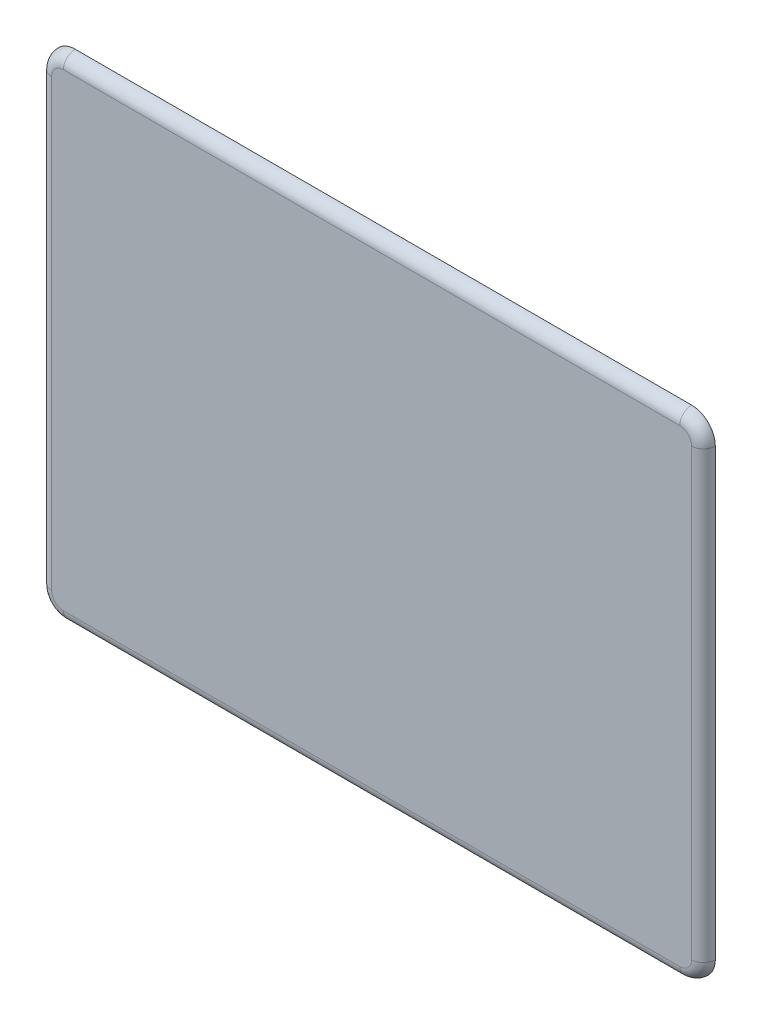
ISO-10303-21;
HEADER;
FILE_DESCRIPTION(('STEP AP214'),'2;1');
FILE_NAME('part.step','',(''),(''),'','','');
FILE_SCHEMA(('AUTOMOTIVE_DESIGN { 1 0 10303 214 1 1 1 1 }'));
ENDSEC;
DATA;
#1=APPLICATION_CONTEXT('core data for automotive mechanical design processes');
#2=APPLICATION_PROTOCOL_DEFINITION('international standard','automotive_design',2000,#1);
#3=PRODUCT_CONTEXT('',#1,'mechanical');
#4=PRODUCT('Part','Part','',(#3));
#5=PRODUCT_RELATED_PRODUCT_CATEGORY('part','',(#4));
#6=PRODUCT_DEFINITION_FORMATION('','',#4);
#7=PRODUCT_DEFINITION_CONTEXT('part definition',#1,'design');
#8=PRODUCT_DEFINITION('design','',#6,#7);
#9=PRODUCT_DEFINITION_SHAPE('','',#8);
#10=(LENGTH_UNIT() NAMED_UNIT(*) SI_UNIT(.MILLI.,.METRE.));
#11=(NAMED_UNIT(*) PLANE_ANGLE_UNIT() SI_UNIT($,.RADIAN.));
#12=(NAMED_UNIT(*) SI_UNIT($,.STERADIAN.) SOLID_ANGLE_UNIT());
#13=UNCERTAINTY_MEASURE_WITH_UNIT(LENGTH_MEASURE(1.E-05),#10,'distance_accuracy_value','');
#14=(GEOMETRIC_REPRESENTATION_CONTEXT(3) GLOBAL_UNCERTAINTY_ASSIGNED_CONTEXT((#13)) GLOBAL_UNIT_ASSIGNED_CONTEXT((#10,
#11,#12)) REPRESENTATION_CONTEXT('',''));
#15=CARTESIAN_POINT('',(0.,0.,0.));
#16=DIRECTION('',(0.,0.,1.));
#17=DIRECTION('',(1.,0.,0.));
#18=AXIS2_PLACEMENT_3D('',#15,#16,#17);
#19=CARTESIAN_POINT('',(0.,0.,0.7));
#20=DIRECTION('',(0.,0.,1.));
#21=DIRECTION('',(1.,0.,0.));
#22=AXIS2_PLACEMENT_3D('',#19,#20,#21);
#23=PLANE('',#22);
#24=CARTESIAN_POINT('',(-1.3,0.938189666446,0.7));
#25=DIRECTION('',(0.,0.,-1.));
#26=DIRECTION('',(-0.707106781186548,0.707106781186548,0.));
#27=AXIS2_PLACEMENT_3D('',#24,#25,#26);
#28=CIRCLE('',#27,0.05);
#29=CARTESIAN_POINT('',(-1.35,0.938189666446,0.7));
#30=VERTEX_POINT('',#29);
#31=CARTESIAN_POINT('',(-1.3,0.988189666446,0.7));
#32=VERTEX_POINT('',#31);
#33=EDGE_CURVE('E120',#30,#32,#28,.T.);
#34=ORIENTED_EDGE('',*,*,#33,.F.);
#35=DIRECTION('',(0.,1.,0.));
#36=VECTOR('',#35,1.);
#37=CARTESIAN_POINT('',(-1.35,-0.519094833223,0.7));
#38=LINE('',#37,#36);
#39=CARTESIAN_POINT('',(-1.35,-0.938189666446,0.7));
#40=VERTEX_POINT('',#39);
#41=EDGE_CURVE('E11',#40,#30,#38,.T.);
#42=ORIENTED_EDGE('',*,*,#41,.F.);
#43=CARTESIAN_POINT('',(-1.3,-0.938189666446,0.7));
#44=DIRECTION('',(0.,0.,-1.));
#45=DIRECTION('',(-0.707106781186548,-0.707106781186548,0.));
#46=AXIS2_PLACEMENT_3D('',#43,#44,#45);
#47=CIRCLE('',#46,0.05);
#48=CARTESIAN_POINT('',(-1.3,-0.988189666446,0.7));
#49=VERTEX_POINT('',#48);
#50=EDGE_CURVE('E29',#49,#40,#47,.T.);
#51=ORIENTED_EDGE('',*,*,#50,.F.);
#52=DIRECTION('',(-1.,0.,0.));
#53=VECTOR('',#52,1.);
#54=CARTESIAN_POINT('',(0.7,-0.988189666446,0.7));
#55=LINE('',#54,#53);
#56=CARTESIAN_POINT('',(1.3,-0.988189666446,0.7));
#57=VERTEX_POINT('',#56);
#58=EDGE_CURVE('E180',#57,#49,#55,.T.);
#59=ORIENTED_EDGE('',*,*,#58,.F.);
#60=CARTESIAN_POINT('',(1.3,-0.938189666446,0.7));
#61=DIRECTION('',(0.,0.,-1.));
#62=DIRECTION('',(0.707106781186548,-0.707106781186548,0.));
#63=AXIS2_PLACEMENT_3D('',#60,#61,#62);
#64=CIRCLE('',#63,0.05);
#65=CARTESIAN_POINT('',(1.35,-0.938189666446,0.7));
#66=VERTEX_POINT('',#65);
#67=EDGE_CURVE('E173',#66,#57,#64,.T.);
#68=ORIENTED_EDGE('',*,*,#67,.F.);
#69=DIRECTION('',(0.,-1.,0.));
#70=VECTOR('',#69,1.);
#71=CARTESIAN_POINT('',(1.35,0.519094833223,0.7));
#72=LINE('',#71,#70);
#73=CARTESIAN_POINT('',(1.35,0.938189666446,0.7));
#74=VERTEX_POINT('',#73);
#75=EDGE_CURVE('E166',#74,#66,#72,.T.);
#76=ORIENTED_EDGE('',*,*,#75,.F.);
#77=CARTESIAN_POINT('',(1.3,0.938189666446,0.7));
#78=DIRECTION('',(0.,0.,-1.));
#79=DIRECTION('',(0.707106781186548,0.707106781186548,0.));
#80=AXIS2_PLACEMENT_3D('',#77,#78,#79);
#81=CIRCLE('',#80,0.05);
#82=CARTESIAN_POINT('',(1.3,0.988189666446,0.7));
#83=VERTEX_POINT('',#82);
#84=EDGE_CURVE('E80',#83,#74,#81,.T.);
#85=ORIENTED_EDGE('',*,*,#84,.F.);
#86=DIRECTION('',(1.,0.,0.));
#87=VECTOR('',#86,1.);
#88=CARTESIAN_POINT('',(-0.7,0.988189666446,0.7));
#89=LINE('',#88,#87);
#90=EDGE_CURVE('E72',#32,#83,#89,.T.);
#91=ORIENTED_EDGE('',*,*,#90,.F.);
#92=EDGE_LOOP('',(#34,#42,#51,#59,#68,#76,#85,#91));
#93=FACE_BOUND('',#92,.T.);
#94=ADVANCED_FACE('F17',(#93),#23,.T.);
#95=CARTESIAN_POINT('',(-1.35,-0.519094833223,0.65));
#96=DIRECTION('',(0.,-1.,0.));
#97=DIRECTION('',(-0.707106781186548,0.,0.707106781186548));
#98=AXIS2_PLACEMENT_3D('',#95,#96,#97);
#99=CYLINDRICAL_SURFACE('',#98,0.05);
#100=CARTESIAN_POINT('',(-1.35,-0.938189666446,0.65));
#101=DIRECTION('',(0.,-1.,0.));
#102=DIRECTION('',(0.,0.,1.));
#103=AXIS2_PLACEMENT_3D('',#100,#101,#102);
#104=CIRCLE('',#103,0.05);
#105=CARTESIAN_POINT('',(-1.4,-0.938189666446,0.65));
#106=VERTEX_POINT('',#105);
#107=EDGE_CURVE('E107',#40,#106,#104,.T.);
#108=ORIENTED_EDGE('',*,*,#107,.F.);
#109=ORIENTED_EDGE('',*,*,#41,.T.);
#110=CARTESIAN_POINT('',(-1.35,0.938189666446,0.65));
#111=DIRECTION('',(0.,1.,0.));
#112=DIRECTION('',(-1.,0.,0.));
#113=AXIS2_PLACEMENT_3D('',#110,#111,#112);
#114=CIRCLE('',#113,0.05);
#115=CARTESIAN_POINT('',(-1.4,0.938189666446,0.65));
#116=VERTEX_POINT('',#115);
#117=EDGE_CURVE('E111',#116,#30,#114,.T.);
#118=ORIENTED_EDGE('',*,*,#117,.F.);
#119=DIRECTION('',(0.,-1.,0.));
#120=VECTOR('',#119,1.);
#121=CARTESIAN_POINT('',(-1.4,-0.519094833223,0.65));
#122=LINE('',#121,#120);
#123=EDGE_CURVE('E115',#116,#106,#122,.T.);
#124=ORIENTED_EDGE('',*,*,#123,.T.);
#125=EDGE_LOOP('',(#108,#109,#118,#124));
#126=FACE_BOUND('',#125,.T.);
#127=ADVANCED_FACE('F113',(#126),#99,.T.);
#128=CARTESIAN_POINT('',(-1.3,-0.988189666446,0.7));
#129=CARTESIAN_POINT('',(-1.35,-0.988189666445999,0.7));
#130=CARTESIAN_POINT('',(-1.35,-0.938189666446,0.7));
#131=CARTESIAN_POINT('',(-1.3,-1.038189666446,0.7));
#132=CARTESIAN_POINT('',(-1.4,-1.038189666446,0.7));
#133=CARTESIAN_POINT('',(-1.4,-0.938189666446,0.7));
#134=CARTESIAN_POINT('',(-1.3,-1.038189666446,0.65));
#135=CARTESIAN_POINT('',(-1.4,-1.038189666446,0.65));
#136=CARTESIAN_POINT('',(-1.4,-0.938189666446,0.65));
#137=(BOUNDED_SURFACE() B_SPLINE_SURFACE(2,2,((#128,#129,#130),(#131,#132,#133),(#134,#135,
#136)),.UNSPECIFIED.,.F.,.F.,.F.) B_SPLINE_SURFACE_WITH_KNOTS((3,3),(3,3),(-1.570796326795,0.),
(-1.570796326795,0.),
.UNSPECIFIED.) GEOMETRIC_REPRESENTATION_ITEM() RATIONAL_B_SPLINE_SURFACE(((1.,0.707106781187,
1.),(0.707106781187,0.5,0.707106781187),(1.,0.707106781187,1.))) REPRESENTATION_ITEM('') SURFACE());
#138=CARTESIAN_POINT('',(-1.3,-0.938189666446,0.65));
#139=DIRECTION('',(0.,0.,1.));
#140=DIRECTION('',(-0.707106781186548,-0.707106781186548,0.));
#141=AXIS2_PLACEMENT_3D('',#138,#139,#140);
#142=CIRCLE('',#141,0.1);
#143=CARTESIAN_POINT('',(-1.3,-1.038189666446,0.65));
#144=VERTEX_POINT('',#143);
#145=EDGE_CURVE('E136',#106,#144,#142,.T.);
#146=CARTESIAN_POINT('',(-1.3,-0.988189666446,0.65));
#147=DIRECTION('',(1.,0.,0.));
#148=DIRECTION('',(0.,0.,1.));
#149=AXIS2_PLACEMENT_3D('',#146,#147,#148);
#150=CIRCLE('',#149,0.05);
#151=EDGE_CURVE('E177',#49,#144,#150,.T.);
#152=ORIENTED_EDGE('',*,*,#107,.T.);
#153=ORIENTED_EDGE('',*,*,#145,.T.);
#154=ORIENTED_EDGE('',*,*,#151,.F.);
#155=ORIENTED_EDGE('',*,*,#50,.T.);
#156=EDGE_LOOP('',(#152,#153,#154,#155));
#157=FACE_BOUND('',#156,.T.);
#158=ADVANCED_FACE('F19',(#157),#137,.F.);
#159=CARTESIAN_POINT('',(0.7,-0.988189666446,0.65));
#160=DIRECTION('',(1.,0.,0.));
#161=DIRECTION('',(0.,-0.707106781186548,0.707106781186548));
#162=AXIS2_PLACEMENT_3D('',#159,#160,#161);
#163=CYLINDRICAL_SURFACE('',#162,0.05);
#164=ORIENTED_EDGE('',*,*,#151,.T.);
#165=DIRECTION('',(1.,0.,0.));
#166=VECTOR('',#165,1.);
#167=CARTESIAN_POINT('',(0.7,-1.038189666446,0.65));
#168=LINE('',#167,#166);
#169=CARTESIAN_POINT('',(1.3,-1.038189666446,0.65));
#170=VERTEX_POINT('',#169);
#171=EDGE_CURVE('E143',#144,#170,#168,.T.);
#172=ORIENTED_EDGE('',*,*,#171,.T.);
#173=CARTESIAN_POINT('',(1.3,-0.988189666446,0.65));
#174=DIRECTION('',(1.,0.,0.));
#175=DIRECTION('',(0.,0.,1.));
#176=AXIS2_PLACEMENT_3D('',#173,#174,#175);
#177=CIRCLE('',#176,0.05);
#178=EDGE_CURVE('E170',#57,#170,#177,.T.);
#179=ORIENTED_EDGE('',*,*,#178,.F.);
#180=ORIENTED_EDGE('',*,*,#58,.T.);
#181=EDGE_LOOP('',(#164,#172,#179,#180));
#182=FACE_BOUND('',#181,.T.);
#183=ADVANCED_FACE('F191',(#182),#163,.T.);
#184=CARTESIAN_POINT('',(1.35,-0.938189666446,0.7));
#185=CARTESIAN_POINT('',(1.35,-0.988189666445999,0.7));
#186=CARTESIAN_POINT('',(1.3,-0.988189666446,0.7));
#187=CARTESIAN_POINT('',(1.4,-0.938189666446,0.7));
#188=CARTESIAN_POINT('',(1.4,-1.038189666446,0.7));
#189=CARTESIAN_POINT('',(1.3,-1.038189666446,0.7));
#190=CARTESIAN_POINT('',(1.4,-0.938189666446,0.65));
#191=CARTESIAN_POINT('',(1.4,-1.038189666446,0.65));
#192=CARTESIAN_POINT('',(1.3,-1.038189666446,0.65));
#193=(BOUNDED_SURFACE() B_SPLINE_SURFACE(2,2,((#184,#185,#186),(#187,#188,#189),(#190,#191,
#192)),.UNSPECIFIED.,.F.,.F.,.F.) B_SPLINE_SURFACE_WITH_KNOTS((3,3),(3,3),(-1.570796326795,0.),
(-3.14159265359,-1.570796326795),
.UNSPECIFIED.) GEOMETRIC_REPRESENTATION_ITEM() RATIONAL_B_SPLINE_SURFACE(((1.,0.707106781187,
1.),(0.707106781187,0.5,0.707106781187),(1.,0.707106781187,1.))) REPRESENTATION_ITEM('') SURFACE());
#194=CARTESIAN_POINT('',(1.3,-0.938189666446,0.65));
#195=DIRECTION('',(0.,0.,1.));
#196=DIRECTION('',(0.707106781186548,-0.707106781186548,0.));
#197=AXIS2_PLACEMENT_3D('',#194,#195,#196);
#198=CIRCLE('',#197,0.1);
#199=CARTESIAN_POINT('',(1.4,-0.938189666446,0.65));
#200=VERTEX_POINT('',#199);
#201=EDGE_CURVE('E198',#170,#200,#198,.T.);
#202=CARTESIAN_POINT('',(1.35,-0.938189666446,0.65));
#203=DIRECTION('',(0.,1.,0.));
#204=DIRECTION('',(0.,0.,1.));
#205=AXIS2_PLACEMENT_3D('',#202,#203,#204);
#206=CIRCLE('',#205,0.05);
#207=EDGE_CURVE('E149',#66,#200,#206,.T.);
#208=ORIENTED_EDGE('',*,*,#178,.T.);
#209=ORIENTED_EDGE('',*,*,#201,.T.);
#210=ORIENTED_EDGE('',*,*,#207,.F.);
#211=ORIENTED_EDGE('',*,*,#67,.T.);
#212=EDGE_LOOP('',(#208,#209,#210,#211));
#213=FACE_BOUND('',#212,.T.);
#214=ADVANCED_FACE('F196',(#213),#193,.F.);
#215=CARTESIAN_POINT('',(1.35,0.519094833223,0.65));
#216=DIRECTION('',(0.,1.,0.));
#217=DIRECTION('',(0.707106781186548,0.,0.707106781186548));
#218=AXIS2_PLACEMENT_3D('',#215,#216,#217);
#219=CYLINDRICAL_SURFACE('',#218,0.05);
#220=ORIENTED_EDGE('',*,*,#207,.T.);
#221=DIRECTION('',(0.,1.,0.));
#222=VECTOR('',#221,1.);
#223=CARTESIAN_POINT('',(1.4,0.519094833223,0.65));
#224=LINE('',#223,#222);
#225=CARTESIAN_POINT('',(1.4,0.938189666446,0.65));
#226=VERTEX_POINT('',#225);
#227=EDGE_CURVE('E203',#200,#226,#224,.T.);
#228=ORIENTED_EDGE('',*,*,#227,.T.);
#229=CARTESIAN_POINT('',(1.35,0.938189666446,0.65));
#230=DIRECTION('',(0.,1.,0.));
#231=DIRECTION('',(0.,0.,1.));
#232=AXIS2_PLACEMENT_3D('',#229,#230,#231);
#233=CIRCLE('',#232,0.05);
#234=EDGE_CURVE('E150',#74,#226,#233,.T.);
#235=ORIENTED_EDGE('',*,*,#234,.F.);
#236=ORIENTED_EDGE('',*,*,#75,.T.);
#237=EDGE_LOOP('',(#220,#228,#235,#236));
#238=FACE_BOUND('',#237,.T.);
#239=ADVANCED_FACE('F201',(#238),#219,.T.);
#240=CARTESIAN_POINT('',(1.3,0.988189666446,0.7));
#241=CARTESIAN_POINT('',(1.35,0.988189666445999,0.7));
#242=CARTESIAN_POINT('',(1.35,0.938189666446,0.7));
#243=CARTESIAN_POINT('',(1.3,1.038189666446,0.7));
#244=CARTESIAN_POINT('',(1.4,1.038189666446,0.7));
#245=CARTESIAN_POINT('',(1.4,0.938189666446,0.7));
#246=CARTESIAN_POINT('',(1.3,1.038189666446,0.65));
#247=CARTESIAN_POINT('',(1.4,1.038189666446,0.65));
#248=CARTESIAN_POINT('',(1.4,0.938189666446,0.65));
#249=(BOUNDED_SURFACE() B_SPLINE_SURFACE(2,2,((#240,#241,#242),(#243,#244,#245),(#246,#247,
#248)),.UNSPECIFIED.,.F.,.F.,.F.) B_SPLINE_SURFACE_WITH_KNOTS((3,3),(3,3),(-1.570796326795,0.),
(1.570796326795,3.14159265359),
.UNSPECIFIED.) GEOMETRIC_REPRESENTATION_ITEM() RATIONAL_B_SPLINE_SURFACE(((1.,0.707106781187,
1.),(0.707106781187,0.5,0.707106781187),(1.,0.707106781187,1.))) REPRESENTATION_ITEM('') SURFACE());
#250=CARTESIAN_POINT('',(1.3,0.938189666446,0.65));
#251=DIRECTION('',(0.,0.,1.));
#252=DIRECTION('',(0.707106781186548,0.707106781186548,0.));
#253=AXIS2_PLACEMENT_3D('',#250,#251,#252);
#254=CIRCLE('',#253,0.1);
#255=CARTESIAN_POINT('',(1.3,1.038189666446,0.65));
#256=VERTEX_POINT('',#255);
#257=EDGE_CURVE('E121',#226,#256,#254,.T.);
#258=CARTESIAN_POINT('',(1.3,0.988189666446,0.65));
#259=DIRECTION('',(-1.,0.,0.));
#260=DIRECTION('',(0.,0.,1.));
#261=AXIS2_PLACEMENT_3D('',#258,#259,#260);
#262=CIRCLE('',#261,0.05);
#263=EDGE_CURVE('E156',#83,#256,#262,.T.);
#264=ORIENTED_EDGE('',*,*,#234,.T.);
#265=ORIENTED_EDGE('',*,*,#257,.T.);
#266=ORIENTED_EDGE('',*,*,#263,.F.);
#267=ORIENTED_EDGE('',*,*,#84,.T.);
#268=EDGE_LOOP('',(#264,#265,#266,#267));
#269=FACE_BOUND('',#268,.T.);
#270=ADVANCED_FACE('F206',(#269),#249,.F.);
#271=CARTESIAN_POINT('',(-0.7,0.988189666446,0.65));
#272=DIRECTION('',(-1.,0.,0.));
#273=DIRECTION('',(0.,0.707106781186548,0.707106781186548));
#274=AXIS2_PLACEMENT_3D('',#271,#272,#273);
#275=CYLINDRICAL_SURFACE('',#274,0.05);
#276=ORIENTED_EDGE('',*,*,#263,.T.);
#277=DIRECTION('',(-1.,0.,0.));
#278=VECTOR('',#277,1.);
#279=CARTESIAN_POINT('',(-0.7,1.038189666446,0.65));
#280=LINE('',#279,#278);
#281=CARTESIAN_POINT('',(-1.3,1.038189666446,0.65));
#282=VERTEX_POINT('',#281);
#283=EDGE_CURVE('E131',#256,#282,#280,.T.);
#284=ORIENTED_EDGE('',*,*,#283,.T.);
#285=CARTESIAN_POINT('',(-1.3,0.988189666446,0.65));
#286=DIRECTION('',(-1.,0.,0.));
#287=DIRECTION('',(0.,0.,1.));
#288=AXIS2_PLACEMENT_3D('',#285,#286,#287);
#289=CIRCLE('',#288,0.05);
#290=EDGE_CURVE('E126',#32,#282,#289,.T.);
#291=ORIENTED_EDGE('',*,*,#290,.F.);
#292=ORIENTED_EDGE('',*,*,#90,.T.);
#293=EDGE_LOOP('',(#276,#284,#291,#292));
#294=FACE_BOUND('',#293,.T.);
#295=ADVANCED_FACE('F299',(#294),#275,.T.);
#296=CARTESIAN_POINT('',(-1.35,0.938189666446,0.7));
#297=CARTESIAN_POINT('',(-1.35,0.988189666445999,0.7));
#298=CARTESIAN_POINT('',(-1.3,0.988189666446,0.7));
#299=CARTESIAN_POINT('',(-1.4,0.938189666446,0.7));
#300=CARTESIAN_POINT('',(-1.4,1.038189666446,0.7));
#301=CARTESIAN_POINT('',(-1.3,1.038189666446,0.7));
#302=CARTESIAN_POINT('',(-1.4,0.938189666446,0.65));
#303=CARTESIAN_POINT('',(-1.4,1.038189666446,0.65));
#304=CARTESIAN_POINT('',(-1.3,1.038189666446,0.65));
#305=(BOUNDED_SURFACE() B_SPLINE_SURFACE(2,2,((#296,#297,#298),(#299,#300,#301),(#302,#303,
#304)),.UNSPECIFIED.,.F.,.F.,.F.) B_SPLINE_SURFACE_WITH_KNOTS((3,3),(3,3),(-1.570796326795,0.),
(0.,1.570796326795),
.UNSPECIFIED.) GEOMETRIC_REPRESENTATION_ITEM() RATIONAL_B_SPLINE_SURFACE(((1.,0.707106781187,
1.),(0.707106781187,0.5,0.707106781187),(1.,0.707106781187,1.))) REPRESENTATION_ITEM('') SURFACE());
#306=CARTESIAN_POINT('',(-1.3,0.938189666446,0.65));
#307=DIRECTION('',(0.,0.,1.));
#308=DIRECTION('',(-0.707106781186548,0.707106781186548,0.));
#309=AXIS2_PLACEMENT_3D('',#306,#307,#308);
#310=CIRCLE('',#309,0.1);
#311=EDGE_CURVE('E124',#282,#116,#310,.T.);
#312=ORIENTED_EDGE('',*,*,#117,.T.);
#313=ORIENTED_EDGE('',*,*,#33,.T.);
#314=ORIENTED_EDGE('',*,*,#290,.T.);
#315=ORIENTED_EDGE('',*,*,#311,.T.);
#316=EDGE_LOOP('',(#312,#313,#314,#315));
#317=FACE_BOUND('',#316,.T.);
#318=ADVANCED_FACE('F125',(#317),#305,.F.);
#319=CARTESIAN_POINT('',(0.17620019485,0.06894789753867,0.65));
#320=DIRECTION('',(0.,0.,1.));
#321=DIRECTION('',(1.,0.,0.));
#322=AXIS2_PLACEMENT_3D('',#319,#320,#321);
#323=PLANE('',#322);
#324=ORIENTED_EDGE('',*,*,#227,.F.);
#325=ORIENTED_EDGE('',*,*,#201,.F.);
#326=ORIENTED_EDGE('',*,*,#171,.F.);
#327=ORIENTED_EDGE('',*,*,#145,.F.);
#328=ORIENTED_EDGE('',*,*,#123,.F.);
#329=ORIENTED_EDGE('',*,*,#311,.F.);
#330=ORIENTED_EDGE('',*,*,#283,.F.);
#331=ORIENTED_EDGE('',*,*,#257,.F.);
#332=EDGE_LOOP('',(#324,#325,#326,#327,#328,#329,#330,#331));
#333=FACE_BOUND('',#332,.T.);
#334=ADVANCED_FACE('F134',(#333),#323,.F.);
#335=CLOSED_SHELL('',(#94,#127,#158,#183,#214,#239,#270,#295,#318,#334));
#336=MANIFOLD_SOLID_BREP('B1',#335);
#337=ADVANCED_BREP_SHAPE_REPRESENTATION('',(#18,#336),#14);
#338=SHAPE_DEFINITION_REPRESENTATION(#9,#337);
ENDSEC;
END-ISO-10303-21;
